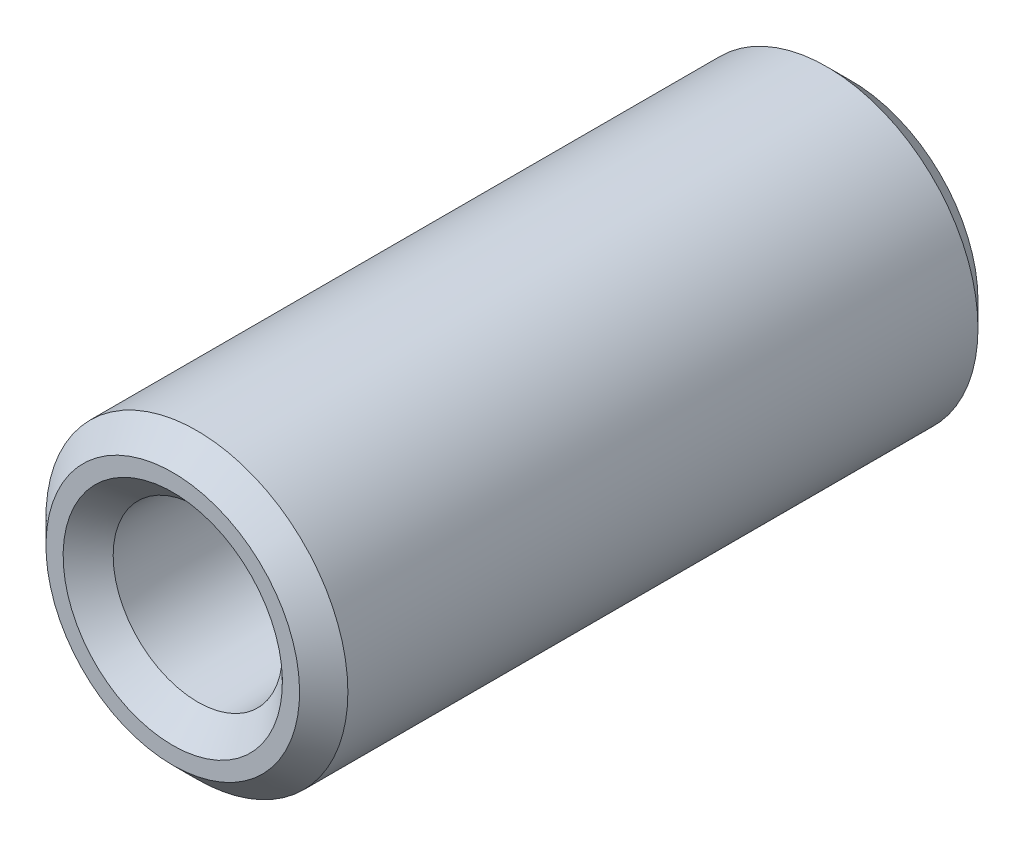
ISO-10303-21;
HEADER;
FILE_DESCRIPTION(('STEP AP214'),'2;1');
FILE_NAME('part.step','',(''),(''),'','','');
FILE_SCHEMA(('AUTOMOTIVE_DESIGN { 1 0 10303 214 1 1 1 1 }'));
ENDSEC;
DATA;
#1=APPLICATION_CONTEXT('core data for automotive mechanical design processes');
#2=APPLICATION_PROTOCOL_DEFINITION('international standard','automotive_design',2000,#1);
#3=PRODUCT_CONTEXT('',#1,'mechanical');
#4=PRODUCT('Part','Part','',(#3));
#5=PRODUCT_RELATED_PRODUCT_CATEGORY('part','',(#4));
#6=PRODUCT_DEFINITION_FORMATION('','',#4);
#7=PRODUCT_DEFINITION_CONTEXT('part definition',#1,'design');
#8=PRODUCT_DEFINITION('design','',#6,#7);
#9=PRODUCT_DEFINITION_SHAPE('','',#8);
#10=(LENGTH_UNIT() NAMED_UNIT(*) SI_UNIT(.MILLI.,.METRE.));
#11=(NAMED_UNIT(*) PLANE_ANGLE_UNIT() SI_UNIT($,.RADIAN.));
#12=(NAMED_UNIT(*) SI_UNIT($,.STERADIAN.) SOLID_ANGLE_UNIT());
#13=UNCERTAINTY_MEASURE_WITH_UNIT(LENGTH_MEASURE(1.E-05),#10,'distance_accuracy_value','');
#14=(GEOMETRIC_REPRESENTATION_CONTEXT(3) GLOBAL_UNCERTAINTY_ASSIGNED_CONTEXT((#13)) GLOBAL_UNIT_ASSIGNED_CONTEXT((#10,
#11,#12)) REPRESENTATION_CONTEXT('',''));
#15=CARTESIAN_POINT('',(0.,0.,0.));
#16=DIRECTION('',(0.,0.,1.));
#17=DIRECTION('',(1.,0.,0.));
#18=AXIS2_PLACEMENT_3D('',#15,#16,#17);
#19=CARTESIAN_POINT('',(0.,6.00969038201323,23.2490061210692));
#20=DIRECTION('',(0.,0.,-1.));
#21=DIRECTION('',(-1.,0.,0.));
#22=AXIS2_PLACEMENT_3D('',#19,#20,#21);
#23=CYLINDRICAL_SURFACE('',#22,3.175);
#24=CARTESIAN_POINT('',(0.,6.00969038201323,0.508000000000005));
#25=DIRECTION('',(0.,0.,1.));
#26=DIRECTION('',(1.,0.,0.));
#27=AXIS2_PLACEMENT_3D('',#24,#25,#26);
#28=CIRCLE('',#27,3.175);
#29=CARTESIAN_POINT('',(3.175,6.00969038201323,0.508000000000005));
#30=VERTEX_POINT('',#29);
#31=EDGE_CURVE('E54',#30,#30,#28,.T.);
#32=ORIENTED_EDGE('',*,*,#31,.T.);
#33=EDGE_LOOP('',(#32));
#34=FACE_BOUND('',#33,.T.);
#35=CARTESIAN_POINT('',(0.,6.00969038201323,13.76075));
#36=DIRECTION('',(0.,0.,1.));
#37=DIRECTION('',(1.,0.,0.));
#38=AXIS2_PLACEMENT_3D('',#35,#36,#37);
#39=CIRCLE('',#38,3.175);
#40=CARTESIAN_POINT('',(3.175,6.00969038201323,13.76075));
#41=VERTEX_POINT('',#40);
#42=EDGE_CURVE('E57',#41,#41,#39,.F.);
#43=ORIENTED_EDGE('',*,*,#42,.T.);
#44=EDGE_LOOP('',(#43));
#45=FACE_BOUND('',#44,.T.);
#46=ADVANCED_FACE('F33',(#34,#45),#23,.T.);
#47=CARTESIAN_POINT('',(0.,6.00969038201323,0.));
#48=DIRECTION('',(0.,0.,1.));
#49=DIRECTION('',(1.,0.,0.));
#50=AXIS2_PLACEMENT_3D('',#47,#48,#49);
#51=PLANE('',#50);
#52=CARTESIAN_POINT('',(0.,6.00969038201323,0.));
#53=DIRECTION('',(0.,0.,1.));
#54=DIRECTION('',(1.,0.,0.));
#55=AXIS2_PLACEMENT_3D('',#52,#53,#54);
#56=CIRCLE('',#55,2.66699999999999);
#57=CARTESIAN_POINT('',(2.66699999999999,6.00969038201323,0.));
#58=VERTEX_POINT('',#57);
#59=EDGE_CURVE('E49',#58,#58,#56,.F.);
#60=ORIENTED_EDGE('',*,*,#59,.T.);
#61=EDGE_LOOP('',(#60));
#62=FACE_BOUND('',#61,.T.);
#63=CARTESIAN_POINT('',(0.,6.00969038201323,0.));
#64=DIRECTION('',(0.,0.,1.));
#65=DIRECTION('',(1.,0.,0.));
#66=AXIS2_PLACEMENT_3D('',#63,#64,#65);
#67=CIRCLE('',#66,1.2999974);
#68=CARTESIAN_POINT('',(1.2999974,6.00969038201323,0.));
#69=VERTEX_POINT('',#68);
#70=EDGE_CURVE('E60',#69,#69,#67,.T.);
#71=ORIENTED_EDGE('',*,*,#70,.T.);
#72=EDGE_LOOP('',(#71));
#73=FACE_BOUND('',#72,.T.);
#74=ADVANCED_FACE('F64',(#62,#73),#51,.F.);
#75=CARTESIAN_POINT('',(0.,6.00969038201323,0.));
#76=DIRECTION('',(0.,0.,1.));
#77=DIRECTION('',(1.,0.,0.));
#78=AXIS2_PLACEMENT_3D('',#75,#76,#77);
#79=CONICAL_SURFACE('',#78,1.2999974,0.0349065850398867);
#80=CARTESIAN_POINT('',(0.,6.00969038201323,13.7423683476537));
#81=DIRECTION('',(0.,0.,-1.));
#82=DIRECTION('',(0.,1.,0.));
#83=AXIS2_PLACEMENT_3D('',#80,#81,#82);
#84=CIRCLE('',#83,1.77989147733911);
#85=CARTESIAN_POINT('',(0.,7.78958185935233,13.7423683476537));
#86=VERTEX_POINT('',#85);
#87=EDGE_CURVE('E45',#86,#86,#84,.F.);
#88=ORIENTED_EDGE('',*,*,#87,.T.);
#89=EDGE_LOOP('',(#88));
#90=FACE_BOUND('',#89,.T.);
#91=ORIENTED_EDGE('',*,*,#70,.F.);
#92=EDGE_LOOP('',(#91));
#93=FACE_BOUND('',#92,.T.);
#94=ADVANCED_FACE('F66',(#90,#93),#79,.F.);
#95=CARTESIAN_POINT('',(0.,6.00969038201323,14.26875));
#96=DIRECTION('',(0.,0.,1.));
#97=DIRECTION('',(0.207911690817756,-0.978147600733806,0.));
#98=AXIS2_PLACEMENT_3D('',#95,#96,#97);
#99=PLANE('',#98);
#100=CARTESIAN_POINT('',(0.,6.00969038201323,14.26875));
#101=DIRECTION('',(0.,0.,1.));
#102=DIRECTION('',(0.,-1.,0.));
#103=AXIS2_PLACEMENT_3D('',#100,#101,#102);
#104=CIRCLE('',#103,2.30627312968539);
#105=CARTESIAN_POINT('',(0.,3.70341725232784,14.26875));
#106=VERTEX_POINT('',#105);
#107=EDGE_CURVE('E10',#106,#106,#104,.F.);
#108=ORIENTED_EDGE('',*,*,#107,.T.);
#109=EDGE_LOOP('',(#108));
#110=FACE_BOUND('',#109,.T.);
#111=CARTESIAN_POINT('',(0.,6.00969038201323,14.26875));
#112=DIRECTION('',(0.,0.,1.));
#113=DIRECTION('',(0.,-1.,0.));
#114=AXIS2_PLACEMENT_3D('',#111,#112,#113);
#115=CIRCLE('',#114,2.667);
#116=CARTESIAN_POINT('',(0.,3.34269038201323,14.26875));
#117=VERTEX_POINT('',#116);
#118=EDGE_CURVE('E41',#117,#117,#115,.T.);
#119=ORIENTED_EDGE('',*,*,#118,.T.);
#120=EDGE_LOOP('',(#119));
#121=FACE_BOUND('',#120,.T.);
#122=ADVANCED_FACE('F68',(#110,#121),#99,.T.);
#123=CARTESIAN_POINT('',(0.,6.00969038201323,0.508000000000005));
#124=DIRECTION('',(0.,0.,1.));
#125=DIRECTION('',(1.,0.,0.));
#126=AXIS2_PLACEMENT_3D('',#123,#124,#125);
#127=CONICAL_SURFACE('',#126,3.175,0.785398163397449);
#128=ORIENTED_EDGE('',*,*,#59,.F.);
#129=EDGE_LOOP('',(#128));
#130=FACE_BOUND('',#129,.T.);
#131=ORIENTED_EDGE('',*,*,#31,.F.);
#132=EDGE_LOOP('',(#131));
#133=FACE_BOUND('',#132,.T.);
#134=ADVANCED_FACE('F75',(#130,#133),#127,.T.);
#135=CARTESIAN_POINT('',(0.,6.00969038201323,13.7423683476537));
#136=DIRECTION('',(0.,0.,1.));
#137=DIRECTION('',(0.,-1.,0.));
#138=AXIS2_PLACEMENT_3D('',#135,#136,#137);
#139=CONICAL_SURFACE('',#138,1.77989147733911,0.785398163397451);
#140=ORIENTED_EDGE('',*,*,#107,.F.);
#141=EDGE_LOOP('',(#140));
#142=FACE_BOUND('',#141,.T.);
#143=ORIENTED_EDGE('',*,*,#87,.F.);
#144=EDGE_LOOP('',(#143));
#145=FACE_BOUND('',#144,.T.);
#146=ADVANCED_FACE('F91',(#142,#145),#139,.F.);
#147=CARTESIAN_POINT('',(0.,6.00969038201323,14.26875));
#148=DIRECTION('',(0.,0.,-1.));
#149=DIRECTION('',(-1.,0.,0.));
#150=AXIS2_PLACEMENT_3D('',#147,#148,#149);
#151=CONICAL_SURFACE('',#150,2.667,0.785398163397446);
#152=ORIENTED_EDGE('',*,*,#42,.F.);
#153=EDGE_LOOP('',(#152));
#154=FACE_BOUND('',#153,.T.);
#155=ORIENTED_EDGE('',*,*,#118,.F.);
#156=EDGE_LOOP('',(#155));
#157=FACE_BOUND('',#156,.T.);
#158=ADVANCED_FACE('F36',(#154,#157),#151,.T.);
#159=CLOSED_SHELL('',(#46,#74,#94,#122,#134,#146,#158));
#160=MANIFOLD_SOLID_BREP('B2',#159);
#161=ADVANCED_BREP_SHAPE_REPRESENTATION('',(#18,#160),#14);
#162=SHAPE_DEFINITION_REPRESENTATION(#9,#161);
ENDSEC;
END-ISO-10303-21;
